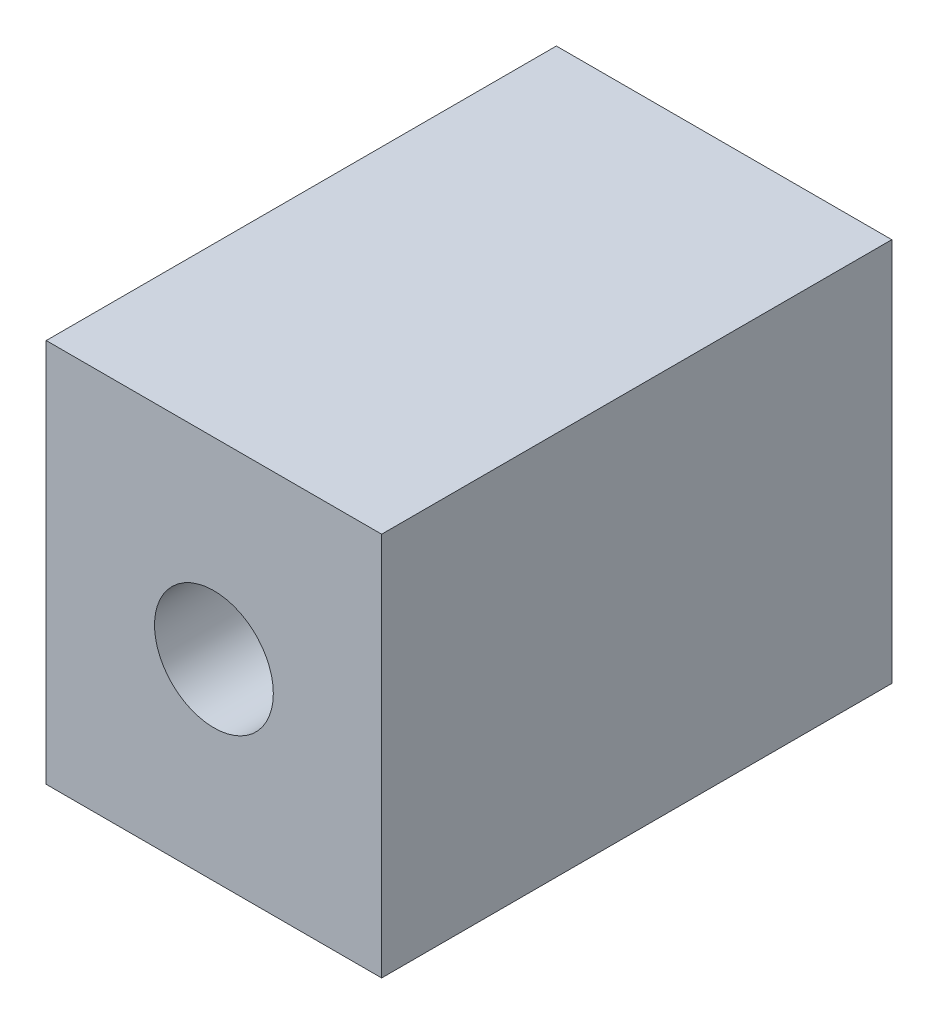
ISO-10303-21;
HEADER;
FILE_DESCRIPTION(('STEP AP214'),'2;1');
FILE_NAME('part.step','',(''),(''),'','','');
FILE_SCHEMA(('AUTOMOTIVE_DESIGN { 1 0 10303 214 1 1 1 1 }'));
ENDSEC;
DATA;
#1=APPLICATION_CONTEXT('core data for automotive mechanical design processes');
#2=APPLICATION_PROTOCOL_DEFINITION('international standard','automotive_design',2000,#1);
#3=PRODUCT_CONTEXT('',#1,'mechanical');
#4=PRODUCT('Part','Part','',(#3));
#5=PRODUCT_RELATED_PRODUCT_CATEGORY('part','',(#4));
#6=PRODUCT_DEFINITION_FORMATION('','',#4);
#7=PRODUCT_DEFINITION_CONTEXT('part definition',#1,'design');
#8=PRODUCT_DEFINITION('design','',#6,#7);
#9=PRODUCT_DEFINITION_SHAPE('','',#8);
#10=(LENGTH_UNIT() NAMED_UNIT(*) SI_UNIT(.MILLI.,.METRE.));
#11=(NAMED_UNIT(*) PLANE_ANGLE_UNIT() SI_UNIT($,.RADIAN.));
#12=(NAMED_UNIT(*) SI_UNIT($,.STERADIAN.) SOLID_ANGLE_UNIT());
#13=UNCERTAINTY_MEASURE_WITH_UNIT(LENGTH_MEASURE(1.E-05),#10,'distance_accuracy_value','');
#14=(GEOMETRIC_REPRESENTATION_CONTEXT(3) GLOBAL_UNCERTAINTY_ASSIGNED_CONTEXT((#13)) GLOBAL_UNIT_ASSIGNED_CONTEXT((#10,
#11,#12)) REPRESENTATION_CONTEXT('',''));
#15=CARTESIAN_POINT('',(0.,0.,0.));
#16=DIRECTION('',(0.,0.,1.));
#17=DIRECTION('',(1.,0.,0.));
#18=AXIS2_PLACEMENT_3D('',#15,#16,#17);
#19=CARTESIAN_POINT('',(0.,0.,21.9));
#20=DIRECTION('',(0.,0.,1.));
#21=DIRECTION('',(1.,0.,0.));
#22=AXIS2_PLACEMENT_3D('',#19,#20,#21);
#23=PLANE('',#22);
#24=DIRECTION('',(0.,-1.,0.));
#25=VECTOR('',#24,1.);
#26=CARTESIAN_POINT('',(-7.2,-8.25,21.9));
#27=LINE('',#26,#25);
#28=CARTESIAN_POINT('',(-7.2,8.25,21.9));
#29=VERTEX_POINT('',#28);
#30=CARTESIAN_POINT('',(-7.2,-8.25,21.9));
#31=VERTEX_POINT('',#30);
#32=EDGE_CURVE('E88',#29,#31,#27,.T.);
#33=ORIENTED_EDGE('',*,*,#32,.T.);
#34=DIRECTION('',(1.,0.,0.));
#35=VECTOR('',#34,1.);
#36=CARTESIAN_POINT('',(7.2,-8.25,21.9));
#37=LINE('',#36,#35);
#38=CARTESIAN_POINT('',(7.2,-8.25,21.9));
#39=VERTEX_POINT('',#38);
#40=EDGE_CURVE('E83',#31,#39,#37,.T.);
#41=ORIENTED_EDGE('',*,*,#40,.T.);
#42=DIRECTION('',(0.,1.,0.));
#43=VECTOR('',#42,1.);
#44=CARTESIAN_POINT('',(7.2,-8.25,21.9));
#45=LINE('',#44,#43);
#46=CARTESIAN_POINT('',(7.2,8.25,21.9));
#47=VERTEX_POINT('',#46);
#48=EDGE_CURVE('E86',#39,#47,#45,.T.);
#49=ORIENTED_EDGE('',*,*,#48,.T.);
#50=DIRECTION('',(-1.,0.,0.));
#51=VECTOR('',#50,1.);
#52=CARTESIAN_POINT('',(7.2,8.25,21.9));
#53=LINE('',#52,#51);
#54=EDGE_CURVE('E53',#47,#29,#53,.T.);
#55=ORIENTED_EDGE('',*,*,#54,.T.);
#56=EDGE_LOOP('',(#33,#41,#49,#55));
#57=FACE_BOUND('',#56,.T.);
#58=CARTESIAN_POINT('',(0.,0.,21.9));
#59=DIRECTION('',(0.,0.,1.));
#60=DIRECTION('',(1.,0.,0.));
#61=AXIS2_PLACEMENT_3D('',#58,#59,#60);
#62=CIRCLE('',#61,2.55);
#63=CARTESIAN_POINT('',(2.55,0.,21.9));
#64=VERTEX_POINT('',#63);
#65=EDGE_CURVE('E103',#64,#64,#62,.T.);
#66=ORIENTED_EDGE('',*,*,#65,.F.);
#67=EDGE_LOOP('',(#66));
#68=FACE_BOUND('',#67,.T.);
#69=ADVANCED_FACE('F36',(#57,#68),#23,.T.);
#70=CARTESIAN_POINT('',(0.,0.,0.));
#71=DIRECTION('',(0.,0.,1.));
#72=DIRECTION('',(1.,0.,0.));
#73=AXIS2_PLACEMENT_3D('',#70,#71,#72);
#74=PLANE('',#73);
#75=DIRECTION('',(0.,-1.,0.));
#76=VECTOR('',#75,1.);
#77=CARTESIAN_POINT('',(-7.2,-8.25,0.));
#78=LINE('',#77,#76);
#79=CARTESIAN_POINT('',(-7.2,8.25,0.));
#80=VERTEX_POINT('',#79);
#81=CARTESIAN_POINT('',(-7.2,-8.25,0.));
#82=VERTEX_POINT('',#81);
#83=EDGE_CURVE('E100',#80,#82,#78,.T.);
#84=ORIENTED_EDGE('',*,*,#83,.F.);
#85=DIRECTION('',(-1.,0.,0.));
#86=VECTOR('',#85,1.);
#87=CARTESIAN_POINT('',(7.2,8.25,0.));
#88=LINE('',#87,#86);
#89=CARTESIAN_POINT('',(7.2,8.25,0.));
#90=VERTEX_POINT('',#89);
#91=EDGE_CURVE('E76',#90,#80,#88,.T.);
#92=ORIENTED_EDGE('',*,*,#91,.F.);
#93=DIRECTION('',(0.,1.,0.));
#94=VECTOR('',#93,1.);
#95=CARTESIAN_POINT('',(7.2,-8.25,0.));
#96=LINE('',#95,#94);
#97=CARTESIAN_POINT('',(7.2,-8.25,0.));
#98=VERTEX_POINT('',#97);
#99=EDGE_CURVE('E70',#98,#90,#96,.T.);
#100=ORIENTED_EDGE('',*,*,#99,.F.);
#101=DIRECTION('',(1.,0.,0.));
#102=VECTOR('',#101,1.);
#103=CARTESIAN_POINT('',(7.2,-8.25,0.));
#104=LINE('',#103,#102);
#105=EDGE_CURVE('E92',#82,#98,#104,.T.);
#106=ORIENTED_EDGE('',*,*,#105,.F.);
#107=EDGE_LOOP('',(#84,#92,#100,#106));
#108=FACE_BOUND('',#107,.T.);
#109=CARTESIAN_POINT('',(0.,0.,0.));
#110=DIRECTION('',(0.,0.,1.));
#111=DIRECTION('',(1.,0.,0.));
#112=AXIS2_PLACEMENT_3D('',#109,#110,#111);
#113=CIRCLE('',#112,2.55);
#114=CARTESIAN_POINT('',(2.55,0.,0.));
#115=VERTEX_POINT('',#114);
#116=EDGE_CURVE('E115',#115,#115,#113,.T.);
#117=ORIENTED_EDGE('',*,*,#116,.T.);
#118=EDGE_LOOP('',(#117));
#119=FACE_BOUND('',#118,.T.);
#120=ADVANCED_FACE('F111',(#108,#119),#74,.F.);
#121=CARTESIAN_POINT('',(-7.2,-8.25,21.9));
#122=DIRECTION('',(1.,0.,0.));
#123=DIRECTION('',(0.,0.,-1.));
#124=AXIS2_PLACEMENT_3D('',#121,#122,#123);
#125=PLANE('',#124);
#126=ORIENTED_EDGE('',*,*,#83,.T.);
#127=DIRECTION('',(0.,0.,-1.));
#128=VECTOR('',#127,1.);
#129=CARTESIAN_POINT('',(-7.2,-8.25,21.9));
#130=LINE('',#129,#128);
#131=EDGE_CURVE('E11',#31,#82,#130,.T.);
#132=ORIENTED_EDGE('',*,*,#131,.F.);
#133=ORIENTED_EDGE('',*,*,#32,.F.);
#134=DIRECTION('',(0.,0.,-1.));
#135=VECTOR('',#134,1.);
#136=CARTESIAN_POINT('',(-7.2,8.25,21.9));
#137=LINE('',#136,#135);
#138=EDGE_CURVE('E96',#29,#80,#137,.T.);
#139=ORIENTED_EDGE('',*,*,#138,.T.);
#140=EDGE_LOOP('',(#126,#132,#133,#139));
#141=FACE_BOUND('',#140,.T.);
#142=ADVANCED_FACE('F38',(#141),#125,.F.);
#143=CARTESIAN_POINT('',(7.2,-8.25,21.9));
#144=DIRECTION('',(0.,1.,0.));
#145=DIRECTION('',(-1.,0.,0.));
#146=AXIS2_PLACEMENT_3D('',#143,#144,#145);
#147=PLANE('',#146);
#148=ORIENTED_EDGE('',*,*,#105,.T.);
#149=DIRECTION('',(0.,0.,-1.));
#150=VECTOR('',#149,1.);
#151=CARTESIAN_POINT('',(7.2,-8.25,21.9));
#152=LINE('',#151,#150);
#153=EDGE_CURVE('E45',#39,#98,#152,.T.);
#154=ORIENTED_EDGE('',*,*,#153,.F.);
#155=ORIENTED_EDGE('',*,*,#40,.F.);
#156=ORIENTED_EDGE('',*,*,#131,.T.);
#157=EDGE_LOOP('',(#148,#154,#155,#156));
#158=FACE_BOUND('',#157,.T.);
#159=ADVANCED_FACE('F91',(#158),#147,.F.);
#160=CARTESIAN_POINT('',(7.2,-8.25,21.9));
#161=DIRECTION('',(-1.,0.,0.));
#162=DIRECTION('',(0.,-1.,0.));
#163=AXIS2_PLACEMENT_3D('',#160,#161,#162);
#164=PLANE('',#163);
#165=ORIENTED_EDGE('',*,*,#99,.T.);
#166=DIRECTION('',(0.,0.,-1.));
#167=VECTOR('',#166,1.);
#168=CARTESIAN_POINT('',(7.2,8.25,21.9));
#169=LINE('',#168,#167);
#170=EDGE_CURVE('E93',#47,#90,#169,.T.);
#171=ORIENTED_EDGE('',*,*,#170,.F.);
#172=ORIENTED_EDGE('',*,*,#48,.F.);
#173=ORIENTED_EDGE('',*,*,#153,.T.);
#174=EDGE_LOOP('',(#165,#171,#172,#173));
#175=FACE_BOUND('',#174,.T.);
#176=ADVANCED_FACE('F94',(#175),#164,.F.);
#177=CARTESIAN_POINT('',(7.2,8.25,21.9));
#178=DIRECTION('',(0.,-1.,0.));
#179=DIRECTION('',(1.,0.,0.));
#180=AXIS2_PLACEMENT_3D('',#177,#178,#179);
#181=PLANE('',#180);
#182=ORIENTED_EDGE('',*,*,#91,.T.);
#183=ORIENTED_EDGE('',*,*,#138,.F.);
#184=ORIENTED_EDGE('',*,*,#54,.F.);
#185=ORIENTED_EDGE('',*,*,#170,.T.);
#186=EDGE_LOOP('',(#182,#183,#184,#185));
#187=FACE_BOUND('',#186,.T.);
#188=ADVANCED_FACE('F108',(#187),#181,.F.);
#189=CARTESIAN_POINT('',(0.,0.,21.9));
#190=DIRECTION('',(0.,0.,-1.));
#191=DIRECTION('',(-1.,0.,0.));
#192=AXIS2_PLACEMENT_3D('',#189,#190,#191);
#193=CYLINDRICAL_SURFACE('',#192,2.55);
#194=ORIENTED_EDGE('',*,*,#65,.T.);
#195=EDGE_LOOP('',(#194));
#196=FACE_BOUND('',#195,.T.);
#197=ORIENTED_EDGE('',*,*,#116,.F.);
#198=EDGE_LOOP('',(#197));
#199=FACE_BOUND('',#198,.T.);
#200=ADVANCED_FACE('F121',(#196,#199),#193,.F.);
#201=CLOSED_SHELL('',(#69,#120,#142,#159,#176,#188,#200));
#202=MANIFOLD_SOLID_BREP('B2',#201);
#203=ADVANCED_BREP_SHAPE_REPRESENTATION('',(#18,#202),#14);
#204=SHAPE_DEFINITION_REPRESENTATION(#9,#203);
ENDSEC;
END-ISO-10303-21;
